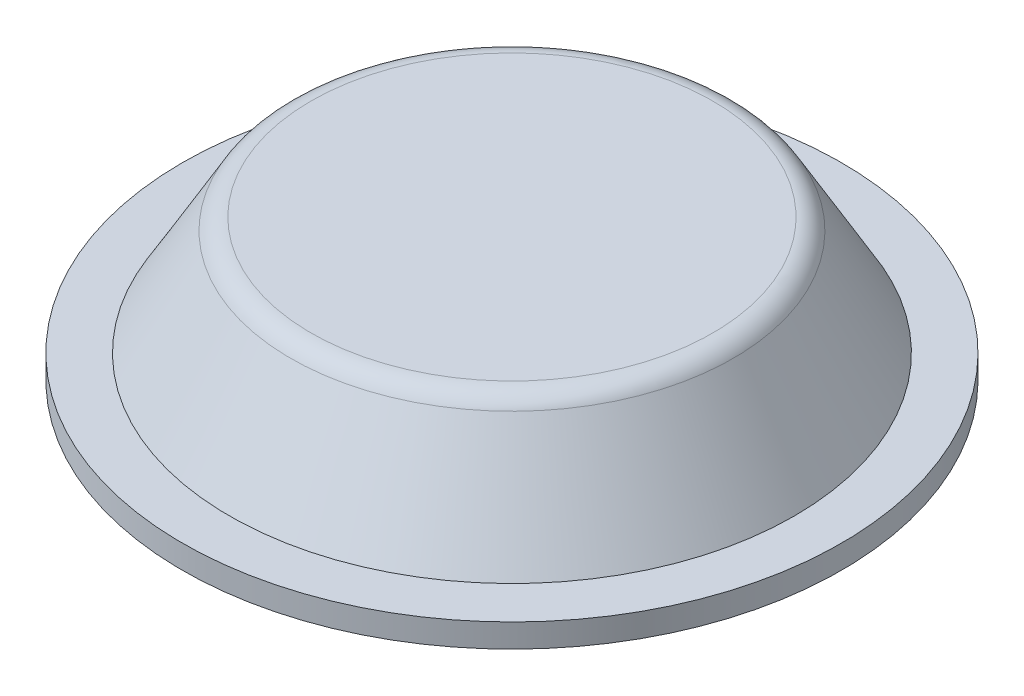
ISO-10303-21;
HEADER;
FILE_DESCRIPTION(('STEP AP214'),'2;1');
FILE_NAME('part.step','',(''),(''),'','','');
FILE_SCHEMA(('AUTOMOTIVE_DESIGN { 1 0 10303 214 1 1 1 1 }'));
ENDSEC;
DATA;
#1=APPLICATION_CONTEXT('core data for automotive mechanical design processes');
#2=APPLICATION_PROTOCOL_DEFINITION('international standard','automotive_design',2000,#1);
#3=PRODUCT_CONTEXT('',#1,'mechanical');
#4=PRODUCT('Part','Part','',(#3));
#5=PRODUCT_RELATED_PRODUCT_CATEGORY('part','',(#4));
#6=PRODUCT_DEFINITION_FORMATION('','',#4);
#7=PRODUCT_DEFINITION_CONTEXT('part definition',#1,'design');
#8=PRODUCT_DEFINITION('design','',#6,#7);
#9=PRODUCT_DEFINITION_SHAPE('','',#8);
#10=(LENGTH_UNIT() NAMED_UNIT(*) SI_UNIT(.MILLI.,.METRE.));
#11=(NAMED_UNIT(*) PLANE_ANGLE_UNIT() SI_UNIT($,.RADIAN.));
#12=(NAMED_UNIT(*) SI_UNIT($,.STERADIAN.) SOLID_ANGLE_UNIT());
#13=UNCERTAINTY_MEASURE_WITH_UNIT(LENGTH_MEASURE(1.E-05),#10,'distance_accuracy_value','');
#14=(GEOMETRIC_REPRESENTATION_CONTEXT(3) GLOBAL_UNCERTAINTY_ASSIGNED_CONTEXT((#13)) GLOBAL_UNIT_ASSIGNED_CONTEXT((#10,
#11,#12)) REPRESENTATION_CONTEXT('',''));
#15=CARTESIAN_POINT('',(0.,0.,0.));
#16=DIRECTION('',(0.,0.,1.));
#17=DIRECTION('',(1.,0.,0.));
#18=AXIS2_PLACEMENT_3D('',#15,#16,#17);
#19=CARTESIAN_POINT('',(-29.0135303162583,0.,0.));
#20=DIRECTION('',(0.,-1.,0.));
#21=DIRECTION('',(1.,0.,0.));
#22=AXIS2_PLACEMENT_3D('',#19,#20,#21);
#23=PLANE('',#22);
#24=CARTESIAN_POINT('',(0.,0.,0.));
#25=DIRECTION('',(0.,1.,0.));
#26=DIRECTION('',(-1.,0.,0.));
#27=AXIS2_PLACEMENT_3D('',#24,#25,#26);
#28=CIRCLE('',#27,29.0135303162583);
#29=CARTESIAN_POINT('',(-29.0135303162583,0.,0.));
#30=VERTEX_POINT('',#29);
#31=EDGE_CURVE('E68',#30,#30,#28,.T.);
#32=ORIENTED_EDGE('',*,*,#31,.T.);
#33=EDGE_LOOP('',(#32));
#34=FACE_BOUND('',#33,.T.);
#35=CARTESIAN_POINT('',(0.,0.,0.));
#36=DIRECTION('',(0.,1.,0.));
#37=DIRECTION('',(-1.,0.,0.));
#38=AXIS2_PLACEMENT_3D('',#35,#36,#37);
#39=CIRCLE('',#38,35.56);
#40=CARTESIAN_POINT('',(-35.56,0.,0.));
#41=VERTEX_POINT('',#40);
#42=EDGE_CURVE('E10',#41,#41,#39,.T.);
#43=ORIENTED_EDGE('',*,*,#42,.F.);
#44=EDGE_LOOP('',(#43));
#45=FACE_BOUND('',#44,.T.);
#46=ADVANCED_FACE('F37',(#34,#45),#23,.T.);
#47=CARTESIAN_POINT('',(0.,15.24,0.));
#48=DIRECTION('',(0.,1.,0.));
#49=DIRECTION('',(-1.,0.,0.));
#50=AXIS2_PLACEMENT_3D('',#47,#48,#49);
#51=CYLINDRICAL_SURFACE('',#50,35.56);
#52=ORIENTED_EDGE('',*,*,#42,.T.);
#53=EDGE_LOOP('',(#52));
#54=FACE_BOUND('',#53,.T.);
#55=CARTESIAN_POINT('',(0.,2.54,0.));
#56=DIRECTION('',(0.,1.,0.));
#57=DIRECTION('',(-1.,0.,0.));
#58=AXIS2_PLACEMENT_3D('',#55,#56,#57);
#59=CIRCLE('',#58,35.56);
#60=CARTESIAN_POINT('',(-35.56,2.54,0.));
#61=VERTEX_POINT('',#60);
#62=EDGE_CURVE('E43',#61,#61,#59,.T.);
#63=ORIENTED_EDGE('',*,*,#62,.F.);
#64=EDGE_LOOP('',(#63));
#65=FACE_BOUND('',#64,.T.);
#66=ADVANCED_FACE('F86',(#54,#65),#51,.T.);
#67=CARTESIAN_POINT('',(-35.56,2.54,0.));
#68=DIRECTION('',(0.,1.,0.));
#69=DIRECTION('',(-1.,0.,0.));
#70=AXIS2_PLACEMENT_3D('',#67,#68,#69);
#71=PLANE('',#70);
#72=ORIENTED_EDGE('',*,*,#62,.T.);
#73=EDGE_LOOP('',(#72));
#74=FACE_BOUND('',#73,.T.);
#75=CARTESIAN_POINT('',(0.,2.54,0.));
#76=DIRECTION('',(0.,1.,0.));
#77=DIRECTION('',(-1.,0.,0.));
#78=AXIS2_PLACEMENT_3D('',#75,#76,#77);
#79=CIRCLE('',#78,30.48);
#80=CARTESIAN_POINT('',(-30.48,2.54,0.));
#81=VERTEX_POINT('',#80);
#82=EDGE_CURVE('E47',#81,#81,#79,.T.);
#83=ORIENTED_EDGE('',*,*,#82,.F.);
#84=EDGE_LOOP('',(#83));
#85=FACE_BOUND('',#84,.T.);
#86=ADVANCED_FACE('F90',(#74,#85),#71,.T.);
#87=CARTESIAN_POINT('',(0.,13.97,0.));
#88=DIRECTION('',(0.,-1.,0.));
#89=DIRECTION('',(1.,0.,0.));
#90=AXIS2_PLACEMENT_3D('',#87,#88,#89);
#91=CONICAL_SURFACE('',#90,23.8808864231626,0.523598775598296);
#92=ORIENTED_EDGE('',*,*,#82,.T.);
#93=EDGE_LOOP('',(#92));
#94=FACE_BOUND('',#93,.T.);
#95=CARTESIAN_POINT('',(0.,13.97,0.));
#96=DIRECTION('',(0.,1.,0.));
#97=DIRECTION('',(-1.,0.,0.));
#98=AXIS2_PLACEMENT_3D('',#95,#96,#97);
#99=CIRCLE('',#98,23.8808864231626);
#100=CARTESIAN_POINT('',(-23.8808864231626,13.97,0.));
#101=VERTEX_POINT('',#100);
#102=EDGE_CURVE('E51',#101,#101,#99,.T.);
#103=ORIENTED_EDGE('',*,*,#102,.F.);
#104=EDGE_LOOP('',(#103));
#105=FACE_BOUND('',#104,.T.);
#106=ADVANCED_FACE('F94',(#94,#105),#91,.T.);
#107=CARTESIAN_POINT('',(0.,12.7,0.));
#108=DIRECTION('',(0.,1.,0.));
#109=DIRECTION('',(-1.,0.,0.));
#110=AXIS2_PLACEMENT_3D('',#107,#108,#109);
#111=TOROIDAL_SURFACE('',#110,21.6811818975501,2.54000000000001);
#112=ORIENTED_EDGE('',*,*,#102,.T.);
#113=EDGE_LOOP('',(#112));
#114=FACE_BOUND('',#113,.T.);
#115=CARTESIAN_POINT('',(0.,15.24,0.));
#116=DIRECTION('',(0.,1.,0.));
#117=DIRECTION('',(-1.,0.,0.));
#118=AXIS2_PLACEMENT_3D('',#115,#116,#117);
#119=CIRCLE('',#118,21.6811818975501);
#120=CARTESIAN_POINT('',(-21.6811818975501,15.24,0.));
#121=VERTEX_POINT('',#120);
#122=EDGE_CURVE('E56',#121,#121,#119,.T.);
#123=ORIENTED_EDGE('',*,*,#122,.F.);
#124=EDGE_LOOP('',(#123));
#125=FACE_BOUND('',#124,.T.);
#126=ADVANCED_FACE('F100',(#114,#125),#111,.T.);
#127=CARTESIAN_POINT('',(-21.6811818975501,15.24,0.));
#128=DIRECTION('',(0.,1.,0.));
#129=DIRECTION('',(-1.,0.,0.));
#130=AXIS2_PLACEMENT_3D('',#127,#128,#129);
#131=PLANE('',#130);
#132=ORIENTED_EDGE('',*,*,#122,.T.);
#133=EDGE_LOOP('',(#132));
#134=FACE_BOUND('',#133,.T.);
#135=ADVANCED_FACE('F104',(#134),#131,.T.);
#136=CARTESIAN_POINT('',(0.,3.81,0.));
#137=DIRECTION('',(0.,-1.,0.));
#138=DIRECTION('',(1.,0.,0.));
#139=AXIS2_PLACEMENT_3D('',#136,#137,#138);
#140=PLANE('',#139);
#141=CARTESIAN_POINT('',(0.,3.81,0.));
#142=DIRECTION('',(0.,1.,0.));
#143=DIRECTION('',(-1.,0.,0.));
#144=AXIS2_PLACEMENT_3D('',#141,#142,#143);
#145=CIRCLE('',#144,2.54);
#146=CARTESIAN_POINT('',(-2.54,3.81,0.));
#147=VERTEX_POINT('',#146);
#148=EDGE_CURVE('E59',#147,#147,#145,.T.);
#149=ORIENTED_EDGE('',*,*,#148,.F.);
#150=EDGE_LOOP('',(#149));
#151=FACE_BOUND('',#150,.T.);
#152=ADVANCED_FACE('F108',(#151),#140,.T.);
#153=CARTESIAN_POINT('',(0.,15.24,0.));
#154=DIRECTION('',(0.,1.,0.));
#155=DIRECTION('',(-1.,0.,0.));
#156=AXIS2_PLACEMENT_3D('',#153,#154,#155);
#157=CYLINDRICAL_SURFACE('',#156,2.54);
#158=ORIENTED_EDGE('',*,*,#148,.T.);
#159=EDGE_LOOP('',(#158));
#160=FACE_BOUND('',#159,.T.);
#161=CARTESIAN_POINT('',(0.,12.7,0.));
#162=DIRECTION('',(0.,1.,0.));
#163=DIRECTION('',(-1.,0.,0.));
#164=AXIS2_PLACEMENT_3D('',#161,#162,#163);
#165=CIRCLE('',#164,2.54);
#166=CARTESIAN_POINT('',(-2.54,12.7,0.));
#167=VERTEX_POINT('',#166);
#168=EDGE_CURVE('E62',#167,#167,#165,.T.);
#169=ORIENTED_EDGE('',*,*,#168,.F.);
#170=EDGE_LOOP('',(#169));
#171=FACE_BOUND('',#170,.T.);
#172=ADVANCED_FACE('F82',(#160,#171),#157,.T.);
#173=CARTESIAN_POINT('',(-2.54,12.7,0.));
#174=DIRECTION('',(0.,-1.,0.));
#175=DIRECTION('',(1.,0.,0.));
#176=AXIS2_PLACEMENT_3D('',#173,#174,#175);
#177=PLANE('',#176);
#178=ORIENTED_EDGE('',*,*,#168,.T.);
#179=EDGE_LOOP('',(#178));
#180=FACE_BOUND('',#179,.T.);
#181=CARTESIAN_POINT('',(0.,12.7,0.));
#182=DIRECTION('',(0.,1.,0.));
#183=DIRECTION('',(-1.,0.,0.));
#184=AXIS2_PLACEMENT_3D('',#181,#182,#183);
#185=CIRCLE('',#184,21.6811818975501);
#186=CARTESIAN_POINT('',(-21.6811818975501,12.7,0.));
#187=VERTEX_POINT('',#186);
#188=EDGE_CURVE('E65',#187,#187,#185,.T.);
#189=ORIENTED_EDGE('',*,*,#188,.F.);
#190=EDGE_LOOP('',(#189));
#191=FACE_BOUND('',#190,.T.);
#192=ADVANCED_FACE('F76',(#180,#191),#177,.T.);
#193=CARTESIAN_POINT('',(0.,0.,0.));
#194=DIRECTION('',(0.,-1.,0.));
#195=DIRECTION('',(1.,0.,0.));
#196=AXIS2_PLACEMENT_3D('',#193,#194,#195);
#197=CONICAL_SURFACE('',#196,29.0135303162583,0.523598775598296);
#198=ORIENTED_EDGE('',*,*,#188,.T.);
#199=EDGE_LOOP('',(#198));
#200=FACE_BOUND('',#199,.T.);
#201=ORIENTED_EDGE('',*,*,#31,.F.);
#202=EDGE_LOOP('',(#201));
#203=FACE_BOUND('',#202,.T.);
#204=ADVANCED_FACE('F74',(#200,#203),#197,.F.);
#205=CLOSED_SHELL('',(#46,#66,#86,#106,#126,#135,#152,#172,#192,#204));
#206=MANIFOLD_SOLID_BREP('B2',#205);
#207=ADVANCED_BREP_SHAPE_REPRESENTATION('',(#18,#206),#14);
#208=SHAPE_DEFINITION_REPRESENTATION(#9,#207);
ENDSEC;
END-ISO-10303-21;
